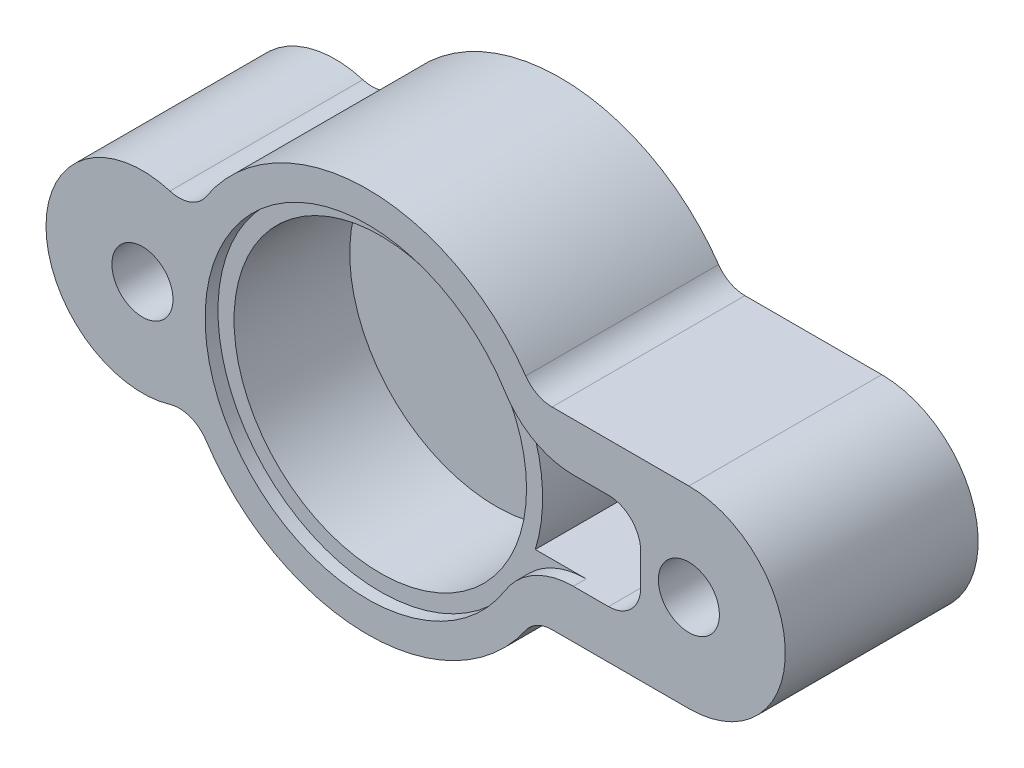
ISO-10303-21;
HEADER;
FILE_DESCRIPTION(('STEP AP214'),'2;1');
FILE_NAME('part.step','',(''),(''),'','','');
FILE_SCHEMA(('AUTOMOTIVE_DESIGN { 1 0 10303 214 1 1 1 1 }'));
ENDSEC;
DATA;
#1=APPLICATION_CONTEXT('core data for automotive mechanical design processes');
#2=APPLICATION_PROTOCOL_DEFINITION('international standard','automotive_design',2000,#1);
#3=PRODUCT_CONTEXT('',#1,'mechanical');
#4=PRODUCT('Part','Part','',(#3));
#5=PRODUCT_RELATED_PRODUCT_CATEGORY('part','',(#4));
#6=PRODUCT_DEFINITION_FORMATION('','',#4);
#7=PRODUCT_DEFINITION_CONTEXT('part definition',#1,'design');
#8=PRODUCT_DEFINITION('design','',#6,#7);
#9=PRODUCT_DEFINITION_SHAPE('','',#8);
#10=(LENGTH_UNIT() NAMED_UNIT(*) SI_UNIT(.MILLI.,.METRE.));
#11=(NAMED_UNIT(*) PLANE_ANGLE_UNIT() SI_UNIT($,.RADIAN.));
#12=(NAMED_UNIT(*) SI_UNIT($,.STERADIAN.) SOLID_ANGLE_UNIT());
#13=UNCERTAINTY_MEASURE_WITH_UNIT(LENGTH_MEASURE(1.E-05),#10,'distance_accuracy_value','');
#14=(GEOMETRIC_REPRESENTATION_CONTEXT(3) GLOBAL_UNCERTAINTY_ASSIGNED_CONTEXT((#13)) GLOBAL_UNIT_ASSIGNED_CONTEXT((#10,
#11,#12)) REPRESENTATION_CONTEXT('',''));
#15=CARTESIAN_POINT('',(0.,0.,0.));
#16=DIRECTION('',(0.,0.,1.));
#17=DIRECTION('',(1.,0.,0.));
#18=AXIS2_PLACEMENT_3D('',#15,#16,#17);
#19=CARTESIAN_POINT('',(0.,0.,12.));
#20=DIRECTION('',(0.,0.,-1.));
#21=DIRECTION('',(-1.,0.,0.));
#22=AXIS2_PLACEMENT_3D('',#19,#20,#21);
#23=CYLINDRICAL_SURFACE('',#22,12.);
#24=CARTESIAN_POINT('',(0.,0.,0.));
#25=DIRECTION('',(0.,0.,1.));
#26=DIRECTION('',(1.,0.,0.));
#27=AXIS2_PLACEMENT_3D('',#24,#25,#26);
#28=CIRCLE('',#27,12.);
#29=CARTESIAN_POINT('',(-10.0408163265306,-6.57130181142795,0.));
#30=VERTEX_POINT('',#29);
#31=CARTESIAN_POINT('',(9.84782167977948,-6.85714285714286,0.));
#32=VERTEX_POINT('',#31);
#33=EDGE_CURVE('E248',#30,#32,#28,.T.);
#34=ORIENTED_EDGE('',*,*,#33,.T.);
#35=DIRECTION('',(0.,0.,-1.));
#36=VECTOR('',#35,1.);
#37=CARTESIAN_POINT('',(9.84782167977948,-6.85714285714286,12.));
#38=LINE('',#37,#36);
#39=CARTESIAN_POINT('',(9.84782167977948,-6.85714285714286,12.));
#40=VERTEX_POINT('',#39);
#41=EDGE_CURVE('E290',#32,#40,#38,.F.);
#42=ORIENTED_EDGE('',*,*,#41,.T.);
#43=CARTESIAN_POINT('',(0.,0.,12.));
#44=DIRECTION('',(0.,0.,1.));
#45=DIRECTION('',(1.,0.,0.));
#46=AXIS2_PLACEMENT_3D('',#43,#44,#45);
#47=CIRCLE('',#46,12.);
#48=CARTESIAN_POINT('',(-10.0408163265306,-6.57130181142795,12.));
#49=VERTEX_POINT('',#48);
#50=EDGE_CURVE('E185',#49,#40,#47,.T.);
#51=ORIENTED_EDGE('',*,*,#50,.F.);
#52=DIRECTION('',(0.,0.,-1.));
#53=VECTOR('',#52,1.);
#54=CARTESIAN_POINT('',(-10.0408163265306,-6.57130181142795,12.));
#55=LINE('',#54,#53);
#56=EDGE_CURVE('E288',#49,#30,#55,.T.);
#57=ORIENTED_EDGE('',*,*,#56,.T.);
#58=EDGE_LOOP('',(#34,#42,#51,#57));
#59=FACE_BOUND('',#58,.T.);
#60=ADVANCED_FACE('F37',(#59),#23,.T.);
#61=CARTESIAN_POINT('',(0.,0.,6.));
#62=DIRECTION('',(0.,0.,1.));
#63=DIRECTION('',(1.,0.,0.));
#64=AXIS2_PLACEMENT_3D('',#61,#62,#63);
#65=CYLINDRICAL_SURFACE('',#64,10.1);
#66=CARTESIAN_POINT('',(0.,0.,11.2));
#67=DIRECTION('',(0.,0.,1.));
#68=DIRECTION('',(1.,0.,0.));
#69=AXIS2_PLACEMENT_3D('',#66,#67,#68);
#70=CIRCLE('',#69,10.1);
#71=CARTESIAN_POINT('',(9.64416922290355,-3.,11.2));
#72=VERTEX_POINT('',#71);
#73=CARTESIAN_POINT('',(9.64416922290355,3.,11.2));
#74=VERTEX_POINT('',#73);
#75=EDGE_CURVE('E214',#72,#74,#70,.T.);
#76=ORIENTED_EDGE('',*,*,#75,.F.);
#77=DIRECTION('',(0.,0.,1.));
#78=VECTOR('',#77,1.);
#79=CARTESIAN_POINT('',(9.64416922290355,-3.,6.));
#80=LINE('',#79,#78);
#81=CARTESIAN_POINT('',(9.64416922290355,-3.,6.));
#82=VERTEX_POINT('',#81);
#83=EDGE_CURVE('E233',#82,#72,#80,.T.);
#84=ORIENTED_EDGE('',*,*,#83,.F.);
#85=CARTESIAN_POINT('',(0.,0.,6.));
#86=DIRECTION('',(0.,0.,-1.));
#87=DIRECTION('',(-1.,0.,0.));
#88=AXIS2_PLACEMENT_3D('',#85,#86,#87);
#89=CIRCLE('',#88,10.1);
#90=CARTESIAN_POINT('',(9.64416922290355,3.,6.));
#91=VERTEX_POINT('',#90);
#92=EDGE_CURVE('E222',#91,#82,#89,.T.);
#93=ORIENTED_EDGE('',*,*,#92,.F.);
#94=DIRECTION('',(0.,0.,1.));
#95=VECTOR('',#94,1.);
#96=CARTESIAN_POINT('',(9.64416922290355,3.,6.));
#97=LINE('',#96,#95);
#98=EDGE_CURVE('E240',#91,#74,#97,.T.);
#99=ORIENTED_EDGE('',*,*,#98,.T.);
#100=EDGE_LOOP('',(#76,#84,#93,#99));
#101=FACE_BOUND('',#100,.T.);
#102=ADVANCED_FACE('F364',(#101),#65,.T.);
#103=CARTESIAN_POINT('',(9.84782167977948,6.85714285714286,12.));
#104=VERTEX_POINT('',#103);
#105=CARTESIAN_POINT('',(-10.0408163265306,6.57130181142795,12.));
#106=VERTEX_POINT('',#105);
#107=EDGE_CURVE('E249',#104,#106,#47,.T.);
#108=ORIENTED_EDGE('',*,*,#107,.F.);
#109=DIRECTION('',(0.,0.,-1.));
#110=VECTOR('',#109,1.);
#111=CARTESIAN_POINT('',(9.84782167977948,6.85714285714286,12.));
#112=LINE('',#111,#110);
#113=CARTESIAN_POINT('',(9.84782167977948,6.85714285714286,0.));
#114=VERTEX_POINT('',#113);
#115=EDGE_CURVE('E295',#104,#114,#112,.T.);
#116=ORIENTED_EDGE('',*,*,#115,.T.);
#117=CARTESIAN_POINT('',(-10.0408163265306,6.57130181142795,0.));
#118=VERTEX_POINT('',#117);
#119=EDGE_CURVE('E255',#114,#118,#28,.T.);
#120=ORIENTED_EDGE('',*,*,#119,.T.);
#121=DIRECTION('',(0.,0.,-1.));
#122=VECTOR('',#121,1.);
#123=CARTESIAN_POINT('',(-10.0408163265306,6.57130181142795,12.));
#124=LINE('',#123,#122);
#125=EDGE_CURVE('E292',#118,#106,#124,.F.);
#126=ORIENTED_EDGE('',*,*,#125,.T.);
#127=EDGE_LOOP('',(#108,#116,#120,#126));
#128=FACE_BOUND('',#127,.T.);
#129=ADVANCED_FACE('F387',(#128),#23,.T.);
#130=CARTESIAN_POINT('',(20.,-6.,12.));
#131=DIRECTION('',(0.,1.,0.));
#132=DIRECTION('',(0.,0.,1.));
#133=AXIS2_PLACEMENT_3D('',#130,#131,#132);
#134=PLANE('',#133);
#135=DIRECTION('',(1.,0.,0.));
#136=VECTOR('',#135,1.);
#137=CARTESIAN_POINT('',(20.,-6.,12.));
#138=LINE('',#137,#136);
#139=CARTESIAN_POINT('',(11.4891252930761,-6.,12.));
#140=VERTEX_POINT('',#139);
#141=CARTESIAN_POINT('',(20.,-6.,12.));
#142=VERTEX_POINT('',#141);
#143=EDGE_CURVE('E252',#140,#142,#138,.T.);
#144=ORIENTED_EDGE('',*,*,#143,.F.);
#145=DIRECTION('',(0.,0.,1.));
#146=VECTOR('',#145,1.);
#147=CARTESIAN_POINT('',(11.4891252930761,-6.,0.));
#148=LINE('',#147,#146);
#149=CARTESIAN_POINT('',(11.4891252930761,-6.,0.));
#150=VERTEX_POINT('',#149);
#151=EDGE_CURVE('E285',#140,#150,#148,.F.);
#152=ORIENTED_EDGE('',*,*,#151,.T.);
#153=DIRECTION('',(1.,0.,0.));
#154=VECTOR('',#153,1.);
#155=CARTESIAN_POINT('',(20.,-6.,0.));
#156=LINE('',#155,#154);
#157=CARTESIAN_POINT('',(20.,-6.,0.));
#158=VERTEX_POINT('',#157);
#159=EDGE_CURVE('E186',#150,#158,#156,.T.);
#160=ORIENTED_EDGE('',*,*,#159,.T.);
#161=DIRECTION('',(0.,0.,-1.));
#162=VECTOR('',#161,1.);
#163=CARTESIAN_POINT('',(20.,-6.,12.));
#164=LINE('',#163,#162);
#165=EDGE_CURVE('E196',#142,#158,#164,.T.);
#166=ORIENTED_EDGE('',*,*,#165,.F.);
#167=EDGE_LOOP('',(#144,#152,#160,#166));
#168=FACE_BOUND('',#167,.T.);
#169=ADVANCED_FACE('F396',(#168),#134,.F.);
#170=CARTESIAN_POINT('',(10.3923048454133,6.,12.));
#171=DIRECTION('',(0.,-1.,0.));
#172=DIRECTION('',(0.,0.,-1.));
#173=AXIS2_PLACEMENT_3D('',#170,#171,#172);
#174=PLANE('',#173);
#175=DIRECTION('',(-1.,0.,0.));
#176=VECTOR('',#175,1.);
#177=CARTESIAN_POINT('',(10.3923048454133,6.,0.));
#178=LINE('',#177,#176);
#179=CARTESIAN_POINT('',(20.,6.,0.));
#180=VERTEX_POINT('',#179);
#181=CARTESIAN_POINT('',(11.4891252930761,6.,0.));
#182=VERTEX_POINT('',#181);
#183=EDGE_CURVE('E174',#180,#182,#178,.T.);
#184=ORIENTED_EDGE('',*,*,#183,.T.);
#185=DIRECTION('',(0.,0.,1.));
#186=VECTOR('',#185,1.);
#187=CARTESIAN_POINT('',(11.4891252930761,6.,12.));
#188=LINE('',#187,#186);
#189=CARTESIAN_POINT('',(11.4891252930761,6.,12.));
#190=VERTEX_POINT('',#189);
#191=EDGE_CURVE('E298',#182,#190,#188,.T.);
#192=ORIENTED_EDGE('',*,*,#191,.T.);
#193=DIRECTION('',(-1.,0.,0.));
#194=VECTOR('',#193,1.);
#195=CARTESIAN_POINT('',(10.3923048454133,6.,12.));
#196=LINE('',#195,#194);
#197=CARTESIAN_POINT('',(20.,6.,12.));
#198=VERTEX_POINT('',#197);
#199=EDGE_CURVE('E192',#198,#190,#196,.T.);
#200=ORIENTED_EDGE('',*,*,#199,.F.);
#201=DIRECTION('',(0.,0.,-1.));
#202=VECTOR('',#201,1.);
#203=CARTESIAN_POINT('',(20.,6.,12.));
#204=LINE('',#203,#202);
#205=EDGE_CURVE('E189',#198,#180,#204,.T.);
#206=ORIENTED_EDGE('',*,*,#205,.T.);
#207=EDGE_LOOP('',(#184,#192,#200,#206));
#208=FACE_BOUND('',#207,.T.);
#209=ADVANCED_FACE('F190',(#208),#174,.F.);
#210=CARTESIAN_POINT('',(0.,0.,12.));
#211=DIRECTION('',(0.,0.,1.));
#212=DIRECTION('',(1.,0.,0.));
#213=AXIS2_PLACEMENT_3D('',#210,#211,#212);
#214=PLANE('',#213);
#215=CARTESIAN_POINT('',(-14.,0.,12.));
#216=DIRECTION('',(0.,0.,1.));
#217=DIRECTION('',(1.,0.,0.));
#218=AXIS2_PLACEMENT_3D('',#215,#216,#217);
#219=CIRCLE('',#218,1.9);
#220=CARTESIAN_POINT('',(-12.1,0.,12.));
#221=VERTEX_POINT('',#220);
#222=EDGE_CURVE('E724',#221,#221,#219,.T.);
#223=ORIENTED_EDGE('',*,*,#222,.F.);
#224=EDGE_LOOP('',(#223));
#225=FACE_BOUND('',#224,.T.);
#226=CARTESIAN_POINT('',(20.,0.,12.));
#227=DIRECTION('',(0.,0.,1.));
#228=DIRECTION('',(1.,0.,0.));
#229=AXIS2_PLACEMENT_3D('',#226,#227,#228);
#230=CIRCLE('',#229,1.9);
#231=CARTESIAN_POINT('',(21.9,0.,12.));
#232=VERTEX_POINT('',#231);
#233=EDGE_CURVE('E722',#232,#232,#230,.T.);
#234=ORIENTED_EDGE('',*,*,#233,.F.);
#235=EDGE_LOOP('',(#234));
#236=FACE_BOUND('',#235,.T.);
#237=ORIENTED_EDGE('',*,*,#199,.T.);
#238=CARTESIAN_POINT('',(11.4891252930761,8.,12.));
#239=DIRECTION('',(0.,0.,1.));
#240=DIRECTION('',(1.,0.,0.));
#241=AXIS2_PLACEMENT_3D('',#238,#239,#240);
#242=CIRCLE('',#241,2.);
#243=EDGE_CURVE('E322',#190,#104,#242,.F.);
#244=ORIENTED_EDGE('',*,*,#243,.T.);
#245=ORIENTED_EDGE('',*,*,#107,.T.);
#246=CARTESIAN_POINT('',(-11.7142857142857,7.66651877999928,12.));
#247=DIRECTION('',(0.,0.,1.));
#248=DIRECTION('',(1.,0.,0.));
#249=AXIS2_PLACEMENT_3D('',#246,#247,#248);
#250=CIRCLE('',#249,2.);
#251=CARTESIAN_POINT('',(-12.2857142857143,5.74988908499946,12.));
#252=VERTEX_POINT('',#251);
#253=EDGE_CURVE('E328',#106,#252,#250,.F.);
#254=ORIENTED_EDGE('',*,*,#253,.T.);
#255=CARTESIAN_POINT('',(-14.,0.,12.));
#256=DIRECTION('',(0.,0.,1.));
#257=DIRECTION('',(1.,0.,0.));
#258=AXIS2_PLACEMENT_3D('',#255,#256,#257);
#259=CIRCLE('',#258,6.);
#260=CARTESIAN_POINT('',(-12.2857142857143,-5.74988908499946,12.));
#261=VERTEX_POINT('',#260);
#262=EDGE_CURVE('E207',#252,#261,#259,.T.);
#263=ORIENTED_EDGE('',*,*,#262,.T.);
#264=CARTESIAN_POINT('',(-11.7142857142857,-7.66651877999928,12.));
#265=DIRECTION('',(0.,0.,1.));
#266=DIRECTION('',(1.,0.,0.));
#267=AXIS2_PLACEMENT_3D('',#264,#265,#266);
#268=CIRCLE('',#267,2.);
#269=EDGE_CURVE('E324',#261,#49,#268,.F.);
#270=ORIENTED_EDGE('',*,*,#269,.T.);
#271=ORIENTED_EDGE('',*,*,#50,.T.);
#272=CARTESIAN_POINT('',(11.4891252930761,-8.,12.));
#273=DIRECTION('',(0.,0.,1.));
#274=DIRECTION('',(1.,0.,0.));
#275=AXIS2_PLACEMENT_3D('',#272,#273,#274);
#276=CIRCLE('',#275,2.);
#277=EDGE_CURVE('E319',#40,#140,#276,.F.);
#278=ORIENTED_EDGE('',*,*,#277,.T.);
#279=ORIENTED_EDGE('',*,*,#143,.T.);
#280=CARTESIAN_POINT('',(20.,0.,12.));
#281=DIRECTION('',(0.,0.,1.));
#282=DIRECTION('',(-1.,0.,0.));
#283=AXIS2_PLACEMENT_3D('',#280,#281,#282);
#284=CIRCLE('',#283,6.);
#285=EDGE_CURVE('E202',#142,#198,#284,.T.);
#286=ORIENTED_EDGE('',*,*,#285,.T.);
#287=EDGE_LOOP('',(#237,#244,#245,#254,#263,#270,#271,#278,#279,#286));
#288=FACE_BOUND('',#287,.T.);
#289=DIRECTION('',(1.,0.,0.));
#290=VECTOR('',#289,1.);
#291=CARTESIAN_POINT('',(17.,-3.,12.));
#292=LINE('',#291,#290);
#293=CARTESIAN_POINT('',(12.8066389033189,-3.,12.));
#294=VERTEX_POINT('',#293);
#295=CARTESIAN_POINT('',(15.,-3.,12.));
#296=VERTEX_POINT('',#295);
#297=EDGE_CURVE('E221',#294,#296,#292,.T.);
#298=ORIENTED_EDGE('',*,*,#297,.F.);
#299=CARTESIAN_POINT('',(12.8066389033189,-8.,12.));
#300=DIRECTION('',(0.,0.,1.));
#301=DIRECTION('',(1.,0.,0.));
#302=AXIS2_PLACEMENT_3D('',#299,#300,#301);
#303=CIRCLE('',#302,5.);
#304=CARTESIAN_POINT('',(8.56602999493513,-5.35099337748344,12.));
#305=VERTEX_POINT('',#304);
#306=EDGE_CURVE('E269',#294,#305,#303,.T.);
#307=ORIENTED_EDGE('',*,*,#306,.T.);
#308=CARTESIAN_POINT('',(0.,0.,12.));
#309=DIRECTION('',(0.,0.,1.));
#310=DIRECTION('',(1.,0.,0.));
#311=AXIS2_PLACEMENT_3D('',#308,#309,#310);
#312=CIRCLE('',#311,10.1);
#313=CARTESIAN_POINT('',(8.56602999493513,5.35099337748344,12.));
#314=VERTEX_POINT('',#313);
#315=EDGE_CURVE('E201',#314,#305,#312,.T.);
#316=ORIENTED_EDGE('',*,*,#315,.F.);
#317=CARTESIAN_POINT('',(12.8066389033189,8.,12.));
#318=DIRECTION('',(0.,0.,1.));
#319=DIRECTION('',(1.,0.,0.));
#320=AXIS2_PLACEMENT_3D('',#317,#318,#319);
#321=CIRCLE('',#320,5.);
#322=CARTESIAN_POINT('',(12.8066389033189,3.,12.));
#323=VERTEX_POINT('',#322);
#324=EDGE_CURVE('E266',#314,#323,#321,.T.);
#325=ORIENTED_EDGE('',*,*,#324,.T.);
#326=DIRECTION('',(-1.,0.,0.));
#327=VECTOR('',#326,1.);
#328=CARTESIAN_POINT('',(9.64416922290355,3.,12.));
#329=LINE('',#328,#327);
#330=CARTESIAN_POINT('',(15.,3.,12.));
#331=VERTEX_POINT('',#330);
#332=EDGE_CURVE('E226',#331,#323,#329,.T.);
#333=ORIENTED_EDGE('',*,*,#332,.F.);
#334=CARTESIAN_POINT('',(15.,1.,12.));
#335=DIRECTION('',(0.,0.,1.));
#336=DIRECTION('',(1.,0.,0.));
#337=AXIS2_PLACEMENT_3D('',#334,#335,#336);
#338=CIRCLE('',#337,2.);
#339=CARTESIAN_POINT('',(17.,1.,12.));
#340=VERTEX_POINT('',#339);
#341=EDGE_CURVE('E11',#331,#340,#338,.F.);
#342=ORIENTED_EDGE('',*,*,#341,.T.);
#343=DIRECTION('',(0.,1.,0.));
#344=VECTOR('',#343,1.);
#345=CARTESIAN_POINT('',(17.,3.,12.));
#346=LINE('',#345,#344);
#347=CARTESIAN_POINT('',(17.,-1.,12.));
#348=VERTEX_POINT('',#347);
#349=EDGE_CURVE('E236',#348,#340,#346,.T.);
#350=ORIENTED_EDGE('',*,*,#349,.F.);
#351=CARTESIAN_POINT('',(15.,-1.,12.));
#352=DIRECTION('',(0.,0.,1.));
#353=DIRECTION('',(1.,0.,0.));
#354=AXIS2_PLACEMENT_3D('',#351,#352,#353);
#355=CIRCLE('',#354,2.);
#356=EDGE_CURVE('E45',#348,#296,#355,.F.);
#357=ORIENTED_EDGE('',*,*,#356,.T.);
#358=EDGE_LOOP('',(#298,#307,#316,#325,#333,#342,#350,#357));
#359=FACE_BOUND('',#358,.T.);
#360=ADVANCED_FACE('F334',(#225,#236,#288,#359),#214,.T.);
#361=CARTESIAN_POINT('',(0.,0.,0.));
#362=DIRECTION('',(0.,0.,1.));
#363=DIRECTION('',(1.,0.,0.));
#364=AXIS2_PLACEMENT_3D('',#361,#362,#363);
#365=PLANE('',#364);
#366=ORIENTED_EDGE('',*,*,#33,.F.);
#367=CARTESIAN_POINT('',(-11.7142857142857,-7.66651877999928,0.));
#368=DIRECTION('',(0.,0.,1.));
#369=DIRECTION('',(1.,0.,0.));
#370=AXIS2_PLACEMENT_3D('',#367,#368,#369);
#371=CIRCLE('',#370,2.);
#372=CARTESIAN_POINT('',(-12.2857142857143,-5.74988908499946,0.));
#373=VERTEX_POINT('',#372);
#374=EDGE_CURVE('E326',#30,#373,#371,.T.);
#375=ORIENTED_EDGE('',*,*,#374,.T.);
#376=CARTESIAN_POINT('',(-14.,0.,0.));
#377=DIRECTION('',(0.,0.,1.));
#378=DIRECTION('',(1.,0.,0.));
#379=AXIS2_PLACEMENT_3D('',#376,#377,#378);
#380=CIRCLE('',#379,6.);
#381=CARTESIAN_POINT('',(-12.2857142857143,5.74988908499946,0.));
#382=VERTEX_POINT('',#381);
#383=EDGE_CURVE('E210',#382,#373,#380,.T.);
#384=ORIENTED_EDGE('',*,*,#383,.F.);
#385=CARTESIAN_POINT('',(-11.7142857142857,7.66651877999928,0.));
#386=DIRECTION('',(0.,0.,1.));
#387=DIRECTION('',(1.,0.,0.));
#388=AXIS2_PLACEMENT_3D('',#385,#386,#387);
#389=CIRCLE('',#388,2.);
#390=EDGE_CURVE('E330',#382,#118,#389,.T.);
#391=ORIENTED_EDGE('',*,*,#390,.T.);
#392=ORIENTED_EDGE('',*,*,#119,.F.);
#393=CARTESIAN_POINT('',(11.4891252930761,8.,0.));
#394=DIRECTION('',(0.,0.,1.));
#395=DIRECTION('',(1.,0.,0.));
#396=AXIS2_PLACEMENT_3D('',#393,#394,#395);
#397=CIRCLE('',#396,2.);
#398=EDGE_CURVE('E182',#114,#182,#397,.T.);
#399=ORIENTED_EDGE('',*,*,#398,.T.);
#400=ORIENTED_EDGE('',*,*,#183,.F.);
#401=CARTESIAN_POINT('',(20.,0.,0.));
#402=DIRECTION('',(0.,0.,1.));
#403=DIRECTION('',(-1.,0.,0.));
#404=AXIS2_PLACEMENT_3D('',#401,#402,#403);
#405=CIRCLE('',#404,6.);
#406=EDGE_CURVE('E180',#158,#180,#405,.T.);
#407=ORIENTED_EDGE('',*,*,#406,.F.);
#408=ORIENTED_EDGE('',*,*,#159,.F.);
#409=CARTESIAN_POINT('',(11.4891252930761,-8.,0.));
#410=DIRECTION('',(0.,0.,1.));
#411=DIRECTION('',(1.,0.,0.));
#412=AXIS2_PLACEMENT_3D('',#409,#410,#411);
#413=CIRCLE('',#412,2.);
#414=EDGE_CURVE('E317',#150,#32,#413,.T.);
#415=ORIENTED_EDGE('',*,*,#414,.T.);
#416=EDGE_LOOP('',(#366,#375,#384,#391,#392,#399,#400,#407,#408,#415));
#417=FACE_BOUND('',#416,.T.);
#418=ADVANCED_FACE('F177',(#417),#365,.F.);
#419=CARTESIAN_POINT('',(9.64416922290355,3.,6.));
#420=DIRECTION('',(0.,1.,0.));
#421=DIRECTION('',(0.,0.,1.));
#422=AXIS2_PLACEMENT_3D('',#419,#420,#421);
#423=PLANE('',#422);
#424=DIRECTION('',(-1.,0.,0.));
#425=VECTOR('',#424,1.);
#426=CARTESIAN_POINT('',(9.64416922290355,3.,6.));
#427=LINE('',#426,#425);
#428=CARTESIAN_POINT('',(15.,3.,6.));
#429=VERTEX_POINT('',#428);
#430=EDGE_CURVE('E231',#429,#91,#427,.T.);
#431=ORIENTED_EDGE('',*,*,#430,.F.);
#432=DIRECTION('',(0.,0.,1.));
#433=VECTOR('',#432,1.);
#434=CARTESIAN_POINT('',(15.,3.,12.));
#435=LINE('',#434,#433);
#436=EDGE_CURVE('E315',#429,#331,#435,.T.);
#437=ORIENTED_EDGE('',*,*,#436,.T.);
#438=ORIENTED_EDGE('',*,*,#332,.T.);
#439=DIRECTION('',(0.,0.,1.));
#440=VECTOR('',#439,1.);
#441=CARTESIAN_POINT('',(12.8066389033189,3.,6.));
#442=LINE('',#441,#440);
#443=CARTESIAN_POINT('',(12.8066389033189,3.,11.2));
#444=VERTEX_POINT('',#443);
#445=EDGE_CURVE('E278',#323,#444,#442,.F.);
#446=ORIENTED_EDGE('',*,*,#445,.T.);
#447=DIRECTION('',(-1.,0.,0.));
#448=VECTOR('',#447,1.);
#449=CARTESIAN_POINT('',(0.,3.,11.2));
#450=LINE('',#449,#448);
#451=EDGE_CURVE('E276',#444,#74,#450,.T.);
#452=ORIENTED_EDGE('',*,*,#451,.T.);
#453=ORIENTED_EDGE('',*,*,#98,.F.);
#454=EDGE_LOOP('',(#431,#437,#438,#446,#452,#453));
#455=FACE_BOUND('',#454,.T.);
#456=ADVANCED_FACE('F350',(#455),#423,.F.);
#457=CARTESIAN_POINT('',(17.,3.,6.));
#458=DIRECTION('',(1.,0.,0.));
#459=DIRECTION('',(0.,0.,-1.));
#460=AXIS2_PLACEMENT_3D('',#457,#458,#459);
#461=PLANE('',#460);
#462=DIRECTION('',(0.,1.,0.));
#463=VECTOR('',#462,1.);
#464=CARTESIAN_POINT('',(17.,3.,6.));
#465=LINE('',#464,#463);
#466=CARTESIAN_POINT('',(17.,-1.,6.));
#467=VERTEX_POINT('',#466);
#468=CARTESIAN_POINT('',(17.,1.,6.));
#469=VERTEX_POINT('',#468);
#470=EDGE_CURVE('E229',#467,#469,#465,.T.);
#471=ORIENTED_EDGE('',*,*,#470,.F.);
#472=DIRECTION('',(0.,0.,1.));
#473=VECTOR('',#472,1.);
#474=CARTESIAN_POINT('',(17.,-1.,12.));
#475=LINE('',#474,#473);
#476=EDGE_CURVE('E307',#467,#348,#475,.T.);
#477=ORIENTED_EDGE('',*,*,#476,.T.);
#478=ORIENTED_EDGE('',*,*,#349,.T.);
#479=DIRECTION('',(0.,0.,1.));
#480=VECTOR('',#479,1.);
#481=CARTESIAN_POINT('',(17.,1.,6.));
#482=LINE('',#481,#480);
#483=EDGE_CURVE('E305',#340,#469,#482,.F.);
#484=ORIENTED_EDGE('',*,*,#483,.T.);
#485=EDGE_LOOP('',(#471,#477,#478,#484));
#486=FACE_BOUND('',#485,.T.);
#487=ADVANCED_FACE('F347',(#486),#461,.F.);
#488=CARTESIAN_POINT('',(17.,-3.,6.));
#489=DIRECTION('',(0.,-1.,0.));
#490=DIRECTION('',(1.,0.,0.));
#491=AXIS2_PLACEMENT_3D('',#488,#489,#490);
#492=PLANE('',#491);
#493=ORIENTED_EDGE('',*,*,#297,.T.);
#494=DIRECTION('',(0.,0.,1.));
#495=VECTOR('',#494,1.);
#496=CARTESIAN_POINT('',(15.,-3.,6.));
#497=LINE('',#496,#495);
#498=CARTESIAN_POINT('',(15.,-3.,6.));
#499=VERTEX_POINT('',#498);
#500=EDGE_CURVE('E310',#296,#499,#497,.F.);
#501=ORIENTED_EDGE('',*,*,#500,.T.);
#502=DIRECTION('',(1.,0.,0.));
#503=VECTOR('',#502,1.);
#504=CARTESIAN_POINT('',(17.,-3.,6.));
#505=LINE('',#504,#503);
#506=EDGE_CURVE('E225',#82,#499,#505,.T.);
#507=ORIENTED_EDGE('',*,*,#506,.F.);
#508=ORIENTED_EDGE('',*,*,#83,.T.);
#509=DIRECTION('',(1.,0.,0.));
#510=VECTOR('',#509,1.);
#511=CARTESIAN_POINT('',(0.,-3.,11.2));
#512=LINE('',#511,#510);
#513=CARTESIAN_POINT('',(12.8066389033189,-3.,11.2));
#514=VERTEX_POINT('',#513);
#515=EDGE_CURVE('E260',#72,#514,#512,.T.);
#516=ORIENTED_EDGE('',*,*,#515,.T.);
#517=DIRECTION('',(0.,0.,1.));
#518=VECTOR('',#517,1.);
#519=CARTESIAN_POINT('',(12.8066389033189,-3.,6.));
#520=LINE('',#519,#518);
#521=EDGE_CURVE('E263',#514,#294,#520,.T.);
#522=ORIENTED_EDGE('',*,*,#521,.T.);
#523=EDGE_LOOP('',(#493,#501,#507,#508,#516,#522));
#524=FACE_BOUND('',#523,.T.);
#525=ADVANCED_FACE('F339',(#524),#492,.F.);
#526=CARTESIAN_POINT('',(0.,0.,6.));
#527=DIRECTION('',(0.,0.,-1.));
#528=DIRECTION('',(-1.,0.,0.));
#529=AXIS2_PLACEMENT_3D('',#526,#527,#528);
#530=PLANE('',#529);
#531=ORIENTED_EDGE('',*,*,#506,.T.);
#532=CARTESIAN_POINT('',(15.,-1.,6.));
#533=DIRECTION('',(0.,0.,-1.));
#534=DIRECTION('',(-1.,0.,0.));
#535=AXIS2_PLACEMENT_3D('',#532,#533,#534);
#536=CIRCLE('',#535,2.);
#537=EDGE_CURVE('E313',#499,#467,#536,.F.);
#538=ORIENTED_EDGE('',*,*,#537,.T.);
#539=ORIENTED_EDGE('',*,*,#470,.T.);
#540=CARTESIAN_POINT('',(15.,1.,6.));
#541=DIRECTION('',(0.,0.,-1.));
#542=DIRECTION('',(-1.,0.,0.));
#543=AXIS2_PLACEMENT_3D('',#540,#541,#542);
#544=CIRCLE('',#543,2.);
#545=EDGE_CURVE('E58',#469,#429,#544,.F.);
#546=ORIENTED_EDGE('',*,*,#545,.T.);
#547=ORIENTED_EDGE('',*,*,#430,.T.);
#548=ORIENTED_EDGE('',*,*,#92,.T.);
#549=EDGE_LOOP('',(#531,#538,#539,#546,#547,#548));
#550=FACE_BOUND('',#549,.T.);
#551=ADVANCED_FACE('F345',(#550),#530,.F.);
#552=CARTESIAN_POINT('',(0.,0.,11.2));
#553=DIRECTION('',(0.,0.,1.));
#554=DIRECTION('',(1.,0.,0.));
#555=AXIS2_PLACEMENT_3D('',#552,#553,#554);
#556=PLANE('',#555);
#557=ORIENTED_EDGE('',*,*,#75,.T.);
#558=ORIENTED_EDGE('',*,*,#451,.F.);
#559=CARTESIAN_POINT('',(12.8066389033189,8.,11.2));
#560=DIRECTION('',(0.,0.,1.));
#561=DIRECTION('',(1.,0.,0.));
#562=AXIS2_PLACEMENT_3D('',#559,#560,#561);
#563=CIRCLE('',#562,5.);
#564=CARTESIAN_POINT('',(8.56602999493513,5.35099337748344,11.2));
#565=VERTEX_POINT('',#564);
#566=EDGE_CURVE('E283',#444,#565,#563,.F.);
#567=ORIENTED_EDGE('',*,*,#566,.T.);
#568=CARTESIAN_POINT('',(0.,0.,11.2));
#569=DIRECTION('',(0.,0.,1.));
#570=DIRECTION('',(1.,0.,0.));
#571=AXIS2_PLACEMENT_3D('',#568,#569,#570);
#572=CIRCLE('',#571,10.1);
#573=CARTESIAN_POINT('',(8.56602999493513,-5.35099337748344,11.2));
#574=VERTEX_POINT('',#573);
#575=EDGE_CURVE('E205',#565,#574,#572,.T.);
#576=ORIENTED_EDGE('',*,*,#575,.T.);
#577=CARTESIAN_POINT('',(12.8066389033189,-8.,11.2));
#578=DIRECTION('',(0.,0.,1.));
#579=DIRECTION('',(1.,0.,0.));
#580=AXIS2_PLACEMENT_3D('',#577,#578,#579);
#581=CIRCLE('',#580,5.);
#582=EDGE_CURVE('E281',#574,#514,#581,.F.);
#583=ORIENTED_EDGE('',*,*,#582,.T.);
#584=ORIENTED_EDGE('',*,*,#515,.F.);
#585=EDGE_LOOP('',(#557,#558,#567,#576,#583,#584));
#586=FACE_BOUND('',#585,.T.);
#587=CARTESIAN_POINT('',(0.,0.,11.2));
#588=DIRECTION('',(0.,0.,1.));
#589=DIRECTION('',(1.,0.,0.));
#590=AXIS2_PLACEMENT_3D('',#587,#588,#589);
#591=CIRCLE('',#590,9.1);
#592=CARTESIAN_POINT('',(9.1,0.,11.2));
#593=VERTEX_POINT('',#592);
#594=EDGE_CURVE('E218',#593,#593,#591,.F.);
#595=ORIENTED_EDGE('',*,*,#594,.T.);
#596=EDGE_LOOP('',(#595));
#597=FACE_BOUND('',#596,.T.);
#598=ADVANCED_FACE('F361',(#586,#597),#556,.T.);
#599=CARTESIAN_POINT('',(0.,0.,11.2));
#600=DIRECTION('',(0.,0.,1.));
#601=DIRECTION('',(1.,0.,0.));
#602=AXIS2_PLACEMENT_3D('',#599,#600,#601);
#603=CYLINDRICAL_SURFACE('',#602,10.1);
#604=ORIENTED_EDGE('',*,*,#315,.T.);
#605=DIRECTION('',(0.,0.,1.));
#606=VECTOR('',#605,1.);
#607=CARTESIAN_POINT('',(8.56602999493513,-5.35099337748344,11.2));
#608=LINE('',#607,#606);
#609=EDGE_CURVE('E274',#305,#574,#608,.F.);
#610=ORIENTED_EDGE('',*,*,#609,.T.);
#611=ORIENTED_EDGE('',*,*,#575,.F.);
#612=DIRECTION('',(0.,0.,1.));
#613=VECTOR('',#612,1.);
#614=CARTESIAN_POINT('',(8.56602999493513,5.35099337748344,11.2));
#615=LINE('',#614,#613);
#616=EDGE_CURVE('E271',#565,#314,#615,.T.);
#617=ORIENTED_EDGE('',*,*,#616,.T.);
#618=EDGE_LOOP('',(#604,#610,#611,#617));
#619=FACE_BOUND('',#618,.T.);
#620=ADVANCED_FACE('F370',(#619),#603,.F.);
#621=CARTESIAN_POINT('',(0.,0.,4.));
#622=DIRECTION('',(0.,0.,1.));
#623=DIRECTION('',(1.,0.,0.));
#624=AXIS2_PLACEMENT_3D('',#621,#622,#623);
#625=PLANE('',#624);
#626=CARTESIAN_POINT('',(0.,0.,4.));
#627=DIRECTION('',(0.,0.,1.));
#628=DIRECTION('',(1.,0.,0.));
#629=AXIS2_PLACEMENT_3D('',#626,#627,#628);
#630=CIRCLE('',#629,9.1);
#631=CARTESIAN_POINT('',(9.1,0.,4.));
#632=VERTEX_POINT('',#631);
#633=EDGE_CURVE('E243',#632,#632,#630,.T.);
#634=ORIENTED_EDGE('',*,*,#633,.T.);
#635=EDGE_LOOP('',(#634));
#636=FACE_BOUND('',#635,.T.);
#637=ADVANCED_FACE('F373',(#636),#625,.T.);
#638=CARTESIAN_POINT('',(0.,0.,4.));
#639=DIRECTION('',(0.,0.,1.));
#640=DIRECTION('',(1.,0.,0.));
#641=AXIS2_PLACEMENT_3D('',#638,#639,#640);
#642=CYLINDRICAL_SURFACE('',#641,9.1);
#643=ORIENTED_EDGE('',*,*,#633,.F.);
#644=EDGE_LOOP('',(#643));
#645=FACE_BOUND('',#644,.T.);
#646=ORIENTED_EDGE('',*,*,#594,.F.);
#647=EDGE_LOOP('',(#646));
#648=FACE_BOUND('',#647,.T.);
#649=ADVANCED_FACE('F379',(#645,#648),#642,.F.);
#650=CARTESIAN_POINT('',(20.,0.,0.));
#651=DIRECTION('',(0.,0.,1.));
#652=DIRECTION('',(1.,0.,0.));
#653=AXIS2_PLACEMENT_3D('',#650,#651,#652);
#654=CYLINDRICAL_SURFACE('',#653,6.);
#655=ORIENTED_EDGE('',*,*,#285,.F.);
#656=ORIENTED_EDGE('',*,*,#165,.T.);
#657=ORIENTED_EDGE('',*,*,#406,.T.);
#658=ORIENTED_EDGE('',*,*,#205,.F.);
#659=EDGE_LOOP('',(#655,#656,#657,#658));
#660=FACE_BOUND('',#659,.T.);
#661=ADVANCED_FACE('F199',(#660),#654,.T.);
#662=CARTESIAN_POINT('',(-14.,0.,0.));
#663=DIRECTION('',(0.,0.,1.));
#664=DIRECTION('',(1.,0.,0.));
#665=AXIS2_PLACEMENT_3D('',#662,#663,#664);
#666=CYLINDRICAL_SURFACE('',#665,6.);
#667=ORIENTED_EDGE('',*,*,#383,.T.);
#668=DIRECTION('',(0.,0.,1.));
#669=VECTOR('',#668,1.);
#670=CARTESIAN_POINT('',(-12.2857142857143,-5.74988908499946,0.));
#671=LINE('',#670,#669);
#672=EDGE_CURVE('E302',#373,#261,#671,.T.);
#673=ORIENTED_EDGE('',*,*,#672,.T.);
#674=ORIENTED_EDGE('',*,*,#262,.F.);
#675=DIRECTION('',(0.,0.,1.));
#676=VECTOR('',#675,1.);
#677=CARTESIAN_POINT('',(-12.2857142857143,5.74988908499946,0.));
#678=LINE('',#677,#676);
#679=EDGE_CURVE('E300',#252,#382,#678,.F.);
#680=ORIENTED_EDGE('',*,*,#679,.T.);
#681=EDGE_LOOP('',(#667,#673,#674,#680));
#682=FACE_BOUND('',#681,.T.);
#683=ADVANCED_FACE('F479',(#682),#666,.T.);
#684=CARTESIAN_POINT('',(20.,0.,2.));
#685=DIRECTION('',(0.,0.,1.));
#686=DIRECTION('',(1.,0.,0.));
#687=AXIS2_PLACEMENT_3D('',#684,#685,#686);
#688=CYLINDRICAL_SURFACE('',#687,1.9);
#689=CARTESIAN_POINT('',(20.,0.,2.));
#690=DIRECTION('',(0.,0.,1.));
#691=DIRECTION('',(1.,0.,0.));
#692=AXIS2_PLACEMENT_3D('',#689,#690,#691);
#693=CIRCLE('',#692,1.9);
#694=CARTESIAN_POINT('',(21.9,0.,2.));
#695=VERTEX_POINT('',#694);
#696=EDGE_CURVE('E719',#695,#695,#693,.T.);
#697=ORIENTED_EDGE('',*,*,#696,.F.);
#698=EDGE_LOOP('',(#697));
#699=FACE_BOUND('',#698,.T.);
#700=ORIENTED_EDGE('',*,*,#233,.T.);
#701=EDGE_LOOP('',(#700));
#702=FACE_BOUND('',#701,.T.);
#703=ADVANCED_FACE('F484',(#699,#702),#688,.F.);
#704=CARTESIAN_POINT('',(20.,0.,2.));
#705=DIRECTION('',(0.,0.,1.));
#706=DIRECTION('',(1.,0.,0.));
#707=AXIS2_PLACEMENT_3D('',#704,#705,#706);
#708=PLANE('',#707);
#709=ORIENTED_EDGE('',*,*,#696,.T.);
#710=EDGE_LOOP('',(#709));
#711=FACE_BOUND('',#710,.T.);
#712=ADVANCED_FACE('F621',(#711),#708,.T.);
#713=CARTESIAN_POINT('',(-14.,0.,2.));
#714=DIRECTION('',(0.,0.,1.));
#715=DIRECTION('',(1.,0.,0.));
#716=AXIS2_PLACEMENT_3D('',#713,#714,#715);
#717=CYLINDRICAL_SURFACE('',#716,1.9);
#718=CARTESIAN_POINT('',(-14.,0.,2.));
#719=DIRECTION('',(0.,0.,1.));
#720=DIRECTION('',(1.,0.,0.));
#721=AXIS2_PLACEMENT_3D('',#718,#719,#720);
#722=CIRCLE('',#721,1.9);
#723=CARTESIAN_POINT('',(-12.1,0.,2.));
#724=VERTEX_POINT('',#723);
#725=EDGE_CURVE('E727',#724,#724,#722,.T.);
#726=ORIENTED_EDGE('',*,*,#725,.F.);
#727=EDGE_LOOP('',(#726));
#728=FACE_BOUND('',#727,.T.);
#729=ORIENTED_EDGE('',*,*,#222,.T.);
#730=EDGE_LOOP('',(#729));
#731=FACE_BOUND('',#730,.T.);
#732=ADVANCED_FACE('F610',(#728,#731),#717,.F.);
#733=CARTESIAN_POINT('',(-14.,0.,2.));
#734=DIRECTION('',(0.,0.,1.));
#735=DIRECTION('',(1.,0.,0.));
#736=AXIS2_PLACEMENT_3D('',#733,#734,#735);
#737=PLANE('',#736);
#738=ORIENTED_EDGE('',*,*,#725,.T.);
#739=EDGE_LOOP('',(#738));
#740=FACE_BOUND('',#739,.T.);
#741=ADVANCED_FACE('F588',(#740),#737,.T.);
#742=CARTESIAN_POINT('',(12.8066389033189,-8.,11.2));
#743=DIRECTION('',(0.,0.,1.));
#744=DIRECTION('',(1.,0.,0.));
#745=AXIS2_PLACEMENT_3D('',#742,#743,#744);
#746=CYLINDRICAL_SURFACE('',#745,5.);
#747=ORIENTED_EDGE('',*,*,#582,.F.);
#748=ORIENTED_EDGE('',*,*,#609,.F.);
#749=ORIENTED_EDGE('',*,*,#306,.F.);
#750=ORIENTED_EDGE('',*,*,#521,.F.);
#751=EDGE_LOOP('',(#747,#748,#749,#750));
#752=FACE_BOUND('',#751,.T.);
#753=ADVANCED_FACE('F367',(#752),#746,.T.);
#754=CARTESIAN_POINT('',(12.8066389033189,8.,11.2));
#755=DIRECTION('',(0.,0.,1.));
#756=DIRECTION('',(1.,0.,0.));
#757=AXIS2_PLACEMENT_3D('',#754,#755,#756);
#758=CYLINDRICAL_SURFACE('',#757,5.);
#759=ORIENTED_EDGE('',*,*,#566,.F.);
#760=ORIENTED_EDGE('',*,*,#445,.F.);
#761=ORIENTED_EDGE('',*,*,#324,.F.);
#762=ORIENTED_EDGE('',*,*,#616,.F.);
#763=EDGE_LOOP('',(#759,#760,#761,#762));
#764=FACE_BOUND('',#763,.T.);
#765=ADVANCED_FACE('F357',(#764),#758,.T.);
#766=CARTESIAN_POINT('',(11.4891252930761,-8.,12.));
#767=DIRECTION('',(0.,0.,-1.));
#768=DIRECTION('',(-1.,0.,0.));
#769=AXIS2_PLACEMENT_3D('',#766,#767,#768);
#770=CYLINDRICAL_SURFACE('',#769,2.);
#771=ORIENTED_EDGE('',*,*,#277,.F.);
#772=ORIENTED_EDGE('',*,*,#41,.F.);
#773=ORIENTED_EDGE('',*,*,#414,.F.);
#774=ORIENTED_EDGE('',*,*,#151,.F.);
#775=EDGE_LOOP('',(#771,#772,#773,#774));
#776=FACE_BOUND('',#775,.T.);
#777=ADVANCED_FACE('F418',(#776),#770,.F.);
#778=CARTESIAN_POINT('',(11.4891252930761,8.,12.));
#779=DIRECTION('',(0.,0.,-1.));
#780=DIRECTION('',(-1.,0.,0.));
#781=AXIS2_PLACEMENT_3D('',#778,#779,#780);
#782=CYLINDRICAL_SURFACE('',#781,2.);
#783=ORIENTED_EDGE('',*,*,#243,.F.);
#784=ORIENTED_EDGE('',*,*,#191,.F.);
#785=ORIENTED_EDGE('',*,*,#398,.F.);
#786=ORIENTED_EDGE('',*,*,#115,.F.);
#787=EDGE_LOOP('',(#783,#784,#785,#786));
#788=FACE_BOUND('',#787,.T.);
#789=ADVANCED_FACE('F408',(#788),#782,.F.);
#790=CARTESIAN_POINT('',(-11.7142857142857,-7.66651877999928,12.));
#791=DIRECTION('',(0.,0.,-1.));
#792=DIRECTION('',(-1.,0.,0.));
#793=AXIS2_PLACEMENT_3D('',#790,#791,#792);
#794=CYLINDRICAL_SURFACE('',#793,2.);
#795=ORIENTED_EDGE('',*,*,#374,.F.);
#796=ORIENTED_EDGE('',*,*,#56,.F.);
#797=ORIENTED_EDGE('',*,*,#269,.F.);
#798=ORIENTED_EDGE('',*,*,#672,.F.);
#799=EDGE_LOOP('',(#795,#796,#797,#798));
#800=FACE_BOUND('',#799,.T.);
#801=ADVANCED_FACE('F425',(#800),#794,.F.);
#802=CARTESIAN_POINT('',(-11.7142857142857,7.66651877999928,0.));
#803=DIRECTION('',(0.,0.,-1.));
#804=DIRECTION('',(-1.,0.,0.));
#805=AXIS2_PLACEMENT_3D('',#802,#803,#804);
#806=CYLINDRICAL_SURFACE('',#805,2.);
#807=ORIENTED_EDGE('',*,*,#390,.F.);
#808=ORIENTED_EDGE('',*,*,#679,.F.);
#809=ORIENTED_EDGE('',*,*,#253,.F.);
#810=ORIENTED_EDGE('',*,*,#125,.F.);
#811=EDGE_LOOP('',(#807,#808,#809,#810));
#812=FACE_BOUND('',#811,.T.);
#813=ADVANCED_FACE('F431',(#812),#806,.F.);
#814=CARTESIAN_POINT('',(15.,-1.,6.));
#815=DIRECTION('',(0.,0.,-1.));
#816=DIRECTION('',(-1.,0.,0.));
#817=AXIS2_PLACEMENT_3D('',#814,#815,#816);
#818=CYLINDRICAL_SURFACE('',#817,2.);
#819=ORIENTED_EDGE('',*,*,#537,.F.);
#820=ORIENTED_EDGE('',*,*,#500,.F.);
#821=ORIENTED_EDGE('',*,*,#356,.F.);
#822=ORIENTED_EDGE('',*,*,#476,.F.);
#823=EDGE_LOOP('',(#819,#820,#821,#822));
#824=FACE_BOUND('',#823,.T.);
#825=ADVANCED_FACE('F343',(#824),#818,.F.);
#826=CARTESIAN_POINT('',(15.,1.,6.));
#827=DIRECTION('',(0.,0.,-1.));
#828=DIRECTION('',(-1.,0.,0.));
#829=AXIS2_PLACEMENT_3D('',#826,#827,#828);
#830=CYLINDRICAL_SURFACE('',#829,2.);
#831=ORIENTED_EDGE('',*,*,#545,.F.);
#832=ORIENTED_EDGE('',*,*,#483,.F.);
#833=ORIENTED_EDGE('',*,*,#341,.F.);
#834=ORIENTED_EDGE('',*,*,#436,.F.);
#835=EDGE_LOOP('',(#831,#832,#833,#834));
#836=FACE_BOUND('',#835,.T.);
#837=ADVANCED_FACE('F39',(#836),#830,.F.);
#838=CLOSED_SHELL('',(#60,#102,#129,#169,#209,#360,#418,#456,#487,#525,#551,#598,#620,#637,#649,
#661,#683,#703,#712,#732,#741,#753,#765,#777,#789,#801,#813,#825,#837));
#839=MANIFOLD_SOLID_BREP('B2',#838);
#840=ADVANCED_BREP_SHAPE_REPRESENTATION('',(#18,#839),#14);
#841=SHAPE_DEFINITION_REPRESENTATION(#9,#840);
ENDSEC;
END-ISO-10303-21;
